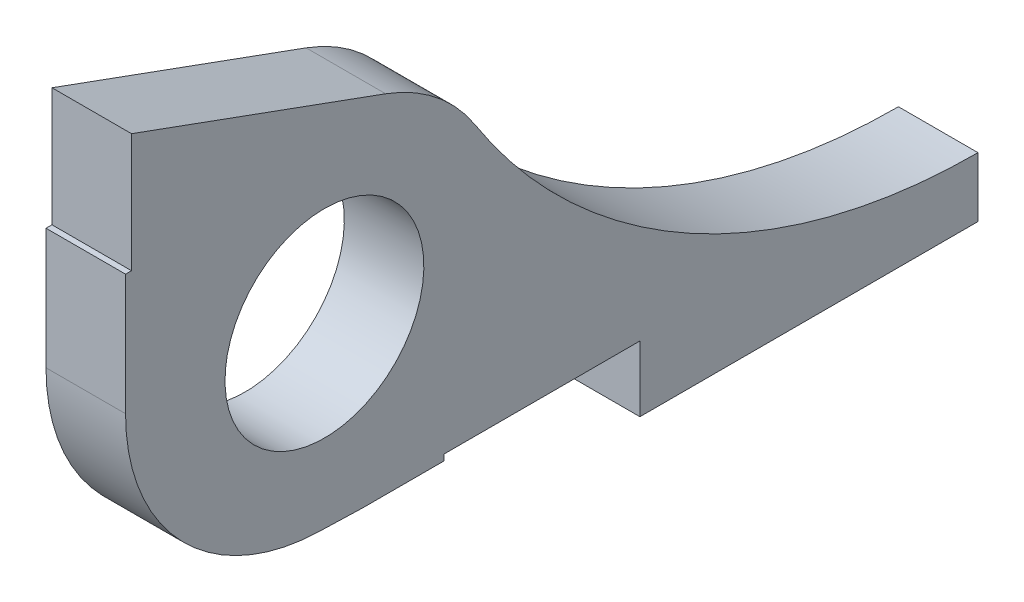
ISO-10303-21;
HEADER;
FILE_DESCRIPTION(('STEP AP214'),'2;1');
FILE_NAME('part.step','',(''),(''),'','','');
FILE_SCHEMA(('AUTOMOTIVE_DESIGN { 1 0 10303 214 1 1 1 1 }'));
ENDSEC;
DATA;
#1=APPLICATION_CONTEXT('core data for automotive mechanical design processes');
#2=APPLICATION_PROTOCOL_DEFINITION('international standard','automotive_design',2000,#1);
#3=PRODUCT_CONTEXT('',#1,'mechanical');
#4=PRODUCT('Part','Part','',(#3));
#5=PRODUCT_RELATED_PRODUCT_CATEGORY('part','',(#4));
#6=PRODUCT_DEFINITION_FORMATION('','',#4);
#7=PRODUCT_DEFINITION_CONTEXT('part definition',#1,'design');
#8=PRODUCT_DEFINITION('design','',#6,#7);
#9=PRODUCT_DEFINITION_SHAPE('','',#8);
#10=(LENGTH_UNIT() NAMED_UNIT(*) SI_UNIT(.MILLI.,.METRE.));
#11=(NAMED_UNIT(*) PLANE_ANGLE_UNIT() SI_UNIT($,.RADIAN.));
#12=(NAMED_UNIT(*) SI_UNIT($,.STERADIAN.) SOLID_ANGLE_UNIT());
#13=UNCERTAINTY_MEASURE_WITH_UNIT(LENGTH_MEASURE(1.E-05),#10,'distance_accuracy_value','');
#14=(GEOMETRIC_REPRESENTATION_CONTEXT(3) GLOBAL_UNCERTAINTY_ASSIGNED_CONTEXT((#13)) GLOBAL_UNIT_ASSIGNED_CONTEXT((#10,
#11,#12)) REPRESENTATION_CONTEXT('',''));
#15=CARTESIAN_POINT('',(0.,0.,0.));
#16=DIRECTION('',(0.,0.,1.));
#17=DIRECTION('',(1.,0.,0.));
#18=AXIS2_PLACEMENT_3D('',#15,#16,#17);
#19=CARTESIAN_POINT('',(195.3,4.3,2.13664654965263));
#20=DIRECTION('',(0.,0.,1.));
#21=DIRECTION('',(1.,0.,0.));
#22=AXIS2_PLACEMENT_3D('',#19,#20,#21);
#23=PLANE('',#22);
#24=DIRECTION('',(0.,-1.,0.));
#25=VECTOR('',#24,1.);
#26=CARTESIAN_POINT('',(191.3,4.3,2.13664654965263));
#27=LINE('',#26,#25);
#28=CARTESIAN_POINT('',(191.3,4.3,2.13664654965263));
#29=VERTEX_POINT('',#28);
#30=CARTESIAN_POINT('',(191.3,1.,2.13664654965263));
#31=VERTEX_POINT('',#30);
#32=EDGE_CURVE('E193',#29,#31,#27,.T.);
#33=ORIENTED_EDGE('',*,*,#32,.T.);
#34=DIRECTION('',(-1.,0.,0.));
#35=VECTOR('',#34,1.);
#36=CARTESIAN_POINT('',(195.3,1.,2.13664654965263));
#37=LINE('',#36,#35);
#38=CARTESIAN_POINT('',(195.3,1.,2.13664654965263));
#39=VERTEX_POINT('',#38);
#40=EDGE_CURVE('E159',#39,#31,#37,.T.);
#41=ORIENTED_EDGE('',*,*,#40,.F.);
#42=DIRECTION('',(0.,-1.,0.));
#43=VECTOR('',#42,1.);
#44=CARTESIAN_POINT('',(195.3,4.3,2.13664654965263));
#45=LINE('',#44,#43);
#46=CARTESIAN_POINT('',(195.3,4.3,2.13664654965263));
#47=VERTEX_POINT('',#46);
#48=EDGE_CURVE('E249',#47,#39,#45,.T.);
#49=ORIENTED_EDGE('',*,*,#48,.F.);
#50=DIRECTION('',(-1.,0.,0.));
#51=VECTOR('',#50,1.);
#52=CARTESIAN_POINT('',(195.3,4.3,2.13664654965263));
#53=LINE('',#52,#51);
#54=EDGE_CURVE('E197',#47,#29,#53,.T.);
#55=ORIENTED_EDGE('',*,*,#54,.T.);
#56=EDGE_LOOP('',(#33,#41,#49,#55));
#57=FACE_BOUND('',#56,.T.);
#58=ADVANCED_FACE('F40',(#57),#23,.T.);
#59=CARTESIAN_POINT('',(195.3,4.3,-14.8633534503474));
#60=DIRECTION('',(0.,0.,-1.));
#61=DIRECTION('',(-1.,0.,0.));
#62=AXIS2_PLACEMENT_3D('',#59,#60,#61);
#63=PLANE('',#62);
#64=DIRECTION('',(0.,-1.,0.));
#65=VECTOR('',#64,1.);
#66=CARTESIAN_POINT('',(195.3,4.3,-14.8633534503474));
#67=LINE('',#66,#65);
#68=CARTESIAN_POINT('',(195.3,4.00000000000068,-14.8633534503474));
#69=VERTEX_POINT('',#68);
#70=CARTESIAN_POINT('',(195.3,1.,-14.8633534503474));
#71=VERTEX_POINT('',#70);
#72=EDGE_CURVE('E176',#69,#71,#67,.T.);
#73=ORIENTED_EDGE('',*,*,#72,.T.);
#74=DIRECTION('',(1.,0.,0.));
#75=VECTOR('',#74,1.);
#76=CARTESIAN_POINT('',(191.3,1.,-14.8633534503474));
#77=LINE('',#76,#75);
#78=CARTESIAN_POINT('',(191.3,1.,-14.8633534503474));
#79=VERTEX_POINT('',#78);
#80=EDGE_CURVE('E57',#79,#71,#77,.T.);
#81=ORIENTED_EDGE('',*,*,#80,.F.);
#82=DIRECTION('',(0.,-1.,0.));
#83=VECTOR('',#82,1.);
#84=CARTESIAN_POINT('',(191.3,4.3,-14.8633534503474));
#85=LINE('',#84,#83);
#86=CARTESIAN_POINT('',(191.3,4.,-14.8633534503474));
#87=VERTEX_POINT('',#86);
#88=EDGE_CURVE('E173',#87,#79,#85,.T.);
#89=ORIENTED_EDGE('',*,*,#88,.F.);
#90=DIRECTION('',(1.,0.,0.));
#91=VECTOR('',#90,1.);
#92=CARTESIAN_POINT('',(191.3,4.00000000000066,-14.8633534503474));
#93=LINE('',#92,#91);
#94=EDGE_CURVE('E196',#87,#69,#93,.T.);
#95=ORIENTED_EDGE('',*,*,#94,.T.);
#96=EDGE_LOOP('',(#73,#81,#89,#95));
#97=FACE_BOUND('',#96,.T.);
#98=ADVANCED_FACE('F172',(#97),#63,.T.);
#99=CARTESIAN_POINT('',(191.3,14.064177772536,18.));
#100=DIRECTION('',(-1.,0.,0.));
#101=DIRECTION('',(0.,-1.,0.));
#102=AXIS2_PLACEMENT_3D('',#99,#100,#101);
#103=PLANE('',#102);
#104=CARTESIAN_POINT('',(191.3,13.0000000000602,18.));
#105=DIRECTION('',(1.,0.,0.));
#106=DIRECTION('',(0.,1.,0.));
#107=AXIS2_PLACEMENT_3D('',#104,#105,#106);
#108=CIRCLE('',#107,5.);
#109=CARTESIAN_POINT('',(191.3,18.0000000000602,18.));
#110=VERTEX_POINT('',#109);
#111=EDGE_CURVE('E184',#110,#110,#108,.T.);
#112=ORIENTED_EDGE('',*,*,#111,.T.);
#113=EDGE_LOOP('',(#112));
#114=FACE_BOUND('',#113,.T.);
#115=ORIENTED_EDGE('',*,*,#88,.T.);
#116=DIRECTION('',(0.,0.,-1.));
#117=VECTOR('',#116,1.);
#118=CARTESIAN_POINT('',(191.3,1.,2.13664654965263));
#119=LINE('',#118,#117);
#120=EDGE_CURVE('E164',#31,#79,#119,.T.);
#121=ORIENTED_EDGE('',*,*,#120,.F.);
#122=ORIENTED_EDGE('',*,*,#32,.F.);
#123=DIRECTION('',(0.,0.,1.));
#124=VECTOR('',#123,1.);
#125=CARTESIAN_POINT('',(191.3,4.3,18.));
#126=LINE('',#125,#124);
#127=CARTESIAN_POINT('',(191.3,4.3,12.));
#128=VERTEX_POINT('',#127);
#129=EDGE_CURVE('E183',#29,#128,#126,.T.);
#130=ORIENTED_EDGE('',*,*,#129,.T.);
#131=DIRECTION('',(0.,-1.,0.));
#132=VECTOR('',#131,1.);
#133=CARTESIAN_POINT('',(191.3,14.064177772536,12.));
#134=LINE('',#133,#132);
#135=CARTESIAN_POINT('',(191.3,4.,12.));
#136=VERTEX_POINT('',#135);
#137=EDGE_CURVE('E186',#128,#136,#134,.T.);
#138=ORIENTED_EDGE('',*,*,#137,.T.);
#139=DIRECTION('',(0.,0.,-1.));
#140=VECTOR('',#139,1.);
#141=CARTESIAN_POINT('',(191.3,4.00000000000066,-14.8633534503474));
#142=LINE('',#141,#140);
#143=CARTESIAN_POINT('',(191.3,4.00000000000066,16.1042417199132));
#144=VERTEX_POINT('',#143);
#145=EDGE_CURVE('E230',#144,#136,#142,.T.);
#146=ORIENTED_EDGE('',*,*,#145,.F.);
#147=DIRECTION('',(0.,-0.0312590373146312,-0.999511316887489));
#148=VECTOR('',#147,1.);
#149=CARTESIAN_POINT('',(191.3,4.00000000000066,16.1042417199132));
#150=LINE('',#149,#148);
#151=CARTESIAN_POINT('',(191.3,4.06906460366128,18.3125903731464));
#152=VERTEX_POINT('',#151);
#153=EDGE_CURVE('E226',#152,#144,#150,.T.);
#154=ORIENTED_EDGE('',*,*,#153,.F.);
#155=CARTESIAN_POINT('',(191.3,14.064177772536,18.));
#156=DIRECTION('',(1.,0.,0.));
#157=DIRECTION('',(0.,-1.,0.));
#158=AXIS2_PLACEMENT_3D('',#155,#156,#157);
#159=CIRCLE('',#158,9.99999999999993);
#160=CARTESIAN_POINT('',(191.3,14.064177772536,28.));
#161=VERTEX_POINT('',#160);
#162=EDGE_CURVE('E227',#161,#152,#159,.T.);
#163=ORIENTED_EDGE('',*,*,#162,.F.);
#164=DIRECTION('',(0.,-1.,0.));
#165=VECTOR('',#164,1.);
#166=CARTESIAN_POINT('',(191.3,14.064177772536,28.));
#167=LINE('',#166,#165);
#168=CARTESIAN_POINT('',(191.3,20.1407400337701,27.9999999999998));
#169=VERTEX_POINT('',#168);
#170=EDGE_CURVE('E240',#169,#161,#167,.T.);
#171=ORIENTED_EDGE('',*,*,#170,.F.);
#172=DIRECTION('',(0.,0.,1.));
#173=VECTOR('',#172,1.);
#174=CARTESIAN_POINT('',(191.3,20.1407400337701,27.6999999999998));
#175=LINE('',#174,#173);
#176=CARTESIAN_POINT('',(191.3,20.1407400337701,27.6999999999998));
#177=VERTEX_POINT('',#176);
#178=EDGE_CURVE('E49',#177,#169,#175,.T.);
#179=ORIENTED_EDGE('',*,*,#178,.F.);
#180=DIRECTION('',(0.,-1.,0.));
#181=VECTOR('',#180,1.);
#182=CARTESIAN_POINT('',(191.3,26.2173022950043,27.6999999999998));
#183=LINE('',#182,#181);
#184=CARTESIAN_POINT('',(191.3,26.1081112247226,27.6999999999998));
#185=VERTEX_POINT('',#184);
#186=EDGE_CURVE('E81',#185,#177,#183,.T.);
#187=ORIENTED_EDGE('',*,*,#186,.F.);
#188=DIRECTION('',(0.,0.342020143325527,0.93969262078596));
#189=VECTOR('',#188,1.);
#190=CARTESIAN_POINT('',(191.3,26.2173022950025,28.));
#191=LINE('',#190,#189);
#192=CARTESIAN_POINT('',(191.3,21.4572335871333,14.9218187100704));
#193=VERTEX_POINT('',#192);
#194=EDGE_CURVE('E209',#193,#185,#191,.T.);
#195=ORIENTED_EDGE('',*,*,#194,.F.);
#196=CARTESIAN_POINT('',(191.3,13.0000000000602,18.));
#197=DIRECTION('',(1.,0.,0.));
#198=DIRECTION('',(0.,-1.,0.));
#199=AXIS2_PLACEMENT_3D('',#196,#197,#198);
#200=CIRCLE('',#199,8.99999999999942);
#201=CARTESIAN_POINT('',(191.3,17.8461538462001,10.4161492037663));
#202=VERTEX_POINT('',#201);
#203=EDGE_CURVE('E235',#202,#193,#200,.T.);
#204=ORIENTED_EDGE('',*,*,#203,.F.);
#205=CARTESIAN_POINT('',(191.3,34.0000000000007,-14.8633534503474));
#206=DIRECTION('',(-1.,0.,0.));
#207=DIRECTION('',(0.,-1.,0.));
#208=AXIS2_PLACEMENT_3D('',#205,#206,#207);
#209=CIRCLE('',#208,30.);
#210=EDGE_CURVE('E182',#87,#202,#209,.T.);
#211=ORIENTED_EDGE('',*,*,#210,.F.);
#212=EDGE_LOOP('',(#115,#121,#122,#130,#138,#146,#154,#163,#171,#179,#187,#195,#204,#211));
#213=FACE_BOUND('',#212,.T.);
#214=ADVANCED_FACE('F180',(#114,#213),#103,.T.);
#215=CARTESIAN_POINT('',(195.3,14.064177772536,18.));
#216=DIRECTION('',(-1.,0.,0.));
#217=DIRECTION('',(0.,-1.,0.));
#218=AXIS2_PLACEMENT_3D('',#215,#216,#217);
#219=PLANE('',#218);
#220=CARTESIAN_POINT('',(195.3,13.0000000000602,18.));
#221=DIRECTION('',(1.,0.,0.));
#222=DIRECTION('',(0.,1.,0.));
#223=AXIS2_PLACEMENT_3D('',#220,#221,#222);
#224=CIRCLE('',#223,5.);
#225=CARTESIAN_POINT('',(195.3,18.0000000000602,18.));
#226=VERTEX_POINT('',#225);
#227=EDGE_CURVE('E189',#226,#226,#224,.T.);
#228=ORIENTED_EDGE('',*,*,#227,.F.);
#229=EDGE_LOOP('',(#228));
#230=FACE_BOUND('',#229,.T.);
#231=DIRECTION('',(0.,0.,1.));
#232=VECTOR('',#231,1.);
#233=CARTESIAN_POINT('',(195.3,1.,-14.8633534503474));
#234=LINE('',#233,#232);
#235=EDGE_CURVE('E177',#71,#39,#234,.T.);
#236=ORIENTED_EDGE('',*,*,#235,.F.);
#237=ORIENTED_EDGE('',*,*,#72,.F.);
#238=CARTESIAN_POINT('',(195.3,34.0000000000007,-14.8633534503474));
#239=DIRECTION('',(-1.,0.,0.));
#240=DIRECTION('',(0.,-1.,0.));
#241=AXIS2_PLACEMENT_3D('',#238,#239,#240);
#242=CIRCLE('',#241,30.);
#243=CARTESIAN_POINT('',(195.3,17.8461538462001,10.4161492037663));
#244=VERTEX_POINT('',#243);
#245=EDGE_CURVE('E247',#69,#244,#242,.T.);
#246=ORIENTED_EDGE('',*,*,#245,.T.);
#247=CARTESIAN_POINT('',(195.3,13.0000000000602,18.));
#248=DIRECTION('',(1.,0.,0.));
#249=DIRECTION('',(0.,-1.,0.));
#250=AXIS2_PLACEMENT_3D('',#247,#248,#249);
#251=CIRCLE('',#250,8.99999999999942);
#252=CARTESIAN_POINT('',(195.3,21.4572335871333,14.9218187100704));
#253=VERTEX_POINT('',#252);
#254=EDGE_CURVE('E244',#244,#253,#251,.T.);
#255=ORIENTED_EDGE('',*,*,#254,.T.);
#256=DIRECTION('',(0.,0.342020143325527,0.93969262078596));
#257=VECTOR('',#256,1.);
#258=CARTESIAN_POINT('',(195.3,26.2173022950025,28.));
#259=LINE('',#258,#257);
#260=CARTESIAN_POINT('',(195.3,26.1081112247226,27.6999999999998));
#261=VERTEX_POINT('',#260);
#262=EDGE_CURVE('E241',#253,#261,#259,.T.);
#263=ORIENTED_EDGE('',*,*,#262,.T.);
#264=DIRECTION('',(0.,1.,0.));
#265=VECTOR('',#264,1.);
#266=CARTESIAN_POINT('',(195.3,14.064177772536,27.6999999999998));
#267=LINE('',#266,#265);
#268=CARTESIAN_POINT('',(195.3,20.1407400337701,27.6999999999998));
#269=VERTEX_POINT('',#268);
#270=EDGE_CURVE('E210',#269,#261,#267,.T.);
#271=ORIENTED_EDGE('',*,*,#270,.F.);
#272=DIRECTION('',(0.,0.,1.));
#273=VECTOR('',#272,1.);
#274=CARTESIAN_POINT('',(195.3,20.1407400337701,18.));
#275=LINE('',#274,#273);
#276=CARTESIAN_POINT('',(195.3,20.1407400337701,27.9999999999998));
#277=VERTEX_POINT('',#276);
#278=EDGE_CURVE('E65',#269,#277,#275,.T.);
#279=ORIENTED_EDGE('',*,*,#278,.T.);
#280=DIRECTION('',(0.,-1.,0.));
#281=VECTOR('',#280,1.);
#282=CARTESIAN_POINT('',(195.3,14.064177772536,28.));
#283=LINE('',#282,#281);
#284=CARTESIAN_POINT('',(195.3,14.064177772536,28.));
#285=VERTEX_POINT('',#284);
#286=EDGE_CURVE('E205',#277,#285,#283,.T.);
#287=ORIENTED_EDGE('',*,*,#286,.T.);
#288=CARTESIAN_POINT('',(195.3,14.064177772536,18.));
#289=DIRECTION('',(1.,0.,0.));
#290=DIRECTION('',(0.,-1.,0.));
#291=AXIS2_PLACEMENT_3D('',#288,#289,#290);
#292=CIRCLE('',#291,9.99999999999993);
#293=CARTESIAN_POINT('',(195.3,4.06906460366129,18.3125903731464));
#294=VERTEX_POINT('',#293);
#295=EDGE_CURVE('E216',#285,#294,#292,.T.);
#296=ORIENTED_EDGE('',*,*,#295,.T.);
#297=DIRECTION('',(0.,-0.0312590373146312,-0.999511316887489));
#298=VECTOR('',#297,1.);
#299=CARTESIAN_POINT('',(195.3,4.00000000000068,16.1042417199132));
#300=LINE('',#299,#298);
#301=CARTESIAN_POINT('',(195.3,4.00000000000068,16.1042417199132));
#302=VERTEX_POINT('',#301);
#303=EDGE_CURVE('E253',#294,#302,#300,.T.);
#304=ORIENTED_EDGE('',*,*,#303,.T.);
#305=DIRECTION('',(0.,0.,-1.));
#306=VECTOR('',#305,1.);
#307=CARTESIAN_POINT('',(195.3,4.00000000000068,-14.8633534503474));
#308=LINE('',#307,#306);
#309=CARTESIAN_POINT('',(195.3,4.,12.));
#310=VERTEX_POINT('',#309);
#311=EDGE_CURVE('E250',#302,#310,#308,.T.);
#312=ORIENTED_EDGE('',*,*,#311,.T.);
#313=DIRECTION('',(0.,-1.,0.));
#314=VECTOR('',#313,1.);
#315=CARTESIAN_POINT('',(195.3,14.064177772536,12.));
#316=LINE('',#315,#314);
#317=CARTESIAN_POINT('',(195.3,4.3,12.));
#318=VERTEX_POINT('',#317);
#319=EDGE_CURVE('E134',#318,#310,#316,.T.);
#320=ORIENTED_EDGE('',*,*,#319,.F.);
#321=DIRECTION('',(0.,0.,1.));
#322=VECTOR('',#321,1.);
#323=CARTESIAN_POINT('',(195.3,4.3,18.));
#324=LINE('',#323,#322);
#325=EDGE_CURVE('E200',#47,#318,#324,.T.);
#326=ORIENTED_EDGE('',*,*,#325,.F.);
#327=ORIENTED_EDGE('',*,*,#48,.T.);
#328=EDGE_LOOP('',(#236,#237,#246,#255,#263,#271,#279,#287,#296,#304,#312,#320,#326,#327));
#329=FACE_BOUND('',#328,.T.);
#330=ADVANCED_FACE('F270',(#230,#329),#219,.F.);
#331=CARTESIAN_POINT('',(191.3,14.064177772536,18.));
#332=DIRECTION('',(1.,0.,0.));
#333=DIRECTION('',(0.,1.,0.));
#334=AXIS2_PLACEMENT_3D('',#331,#332,#333);
#335=CYLINDRICAL_SURFACE('',#334,9.99999999999993);
#336=ORIENTED_EDGE('',*,*,#295,.F.);
#337=DIRECTION('',(1.,0.,0.));
#338=VECTOR('',#337,1.);
#339=CARTESIAN_POINT('',(191.3,14.064177772536,28.));
#340=LINE('',#339,#338);
#341=EDGE_CURVE('E237',#161,#285,#340,.T.);
#342=ORIENTED_EDGE('',*,*,#341,.F.);
#343=ORIENTED_EDGE('',*,*,#162,.T.);
#344=DIRECTION('',(1.,0.,0.));
#345=VECTOR('',#344,1.);
#346=CARTESIAN_POINT('',(191.3,4.06906460366128,18.3125903731464));
#347=LINE('',#346,#345);
#348=EDGE_CURVE('E153',#152,#294,#347,.T.);
#349=ORIENTED_EDGE('',*,*,#348,.T.);
#350=EDGE_LOOP('',(#336,#342,#343,#349));
#351=FACE_BOUND('',#350,.T.);
#352=ADVANCED_FACE('F285',(#351),#335,.T.);
#353=CARTESIAN_POINT('',(191.3,4.00000000000066,16.1042417199132));
#354=DIRECTION('',(0.,-0.999511316887489,0.0312590373146312));
#355=DIRECTION('',(0.,-0.0312590373146312,-0.999511316887489));
#356=AXIS2_PLACEMENT_3D('',#353,#354,#355);
#357=PLANE('',#356);
#358=ORIENTED_EDGE('',*,*,#303,.F.);
#359=ORIENTED_EDGE('',*,*,#348,.F.);
#360=ORIENTED_EDGE('',*,*,#153,.T.);
#361=DIRECTION('',(1.,0.,0.));
#362=VECTOR('',#361,1.);
#363=CARTESIAN_POINT('',(191.3,4.00000000000066,16.1042417199132));
#364=LINE('',#363,#362);
#365=EDGE_CURVE('E228',#144,#302,#364,.T.);
#366=ORIENTED_EDGE('',*,*,#365,.T.);
#367=EDGE_LOOP('',(#358,#359,#360,#366));
#368=FACE_BOUND('',#367,.T.);
#369=ADVANCED_FACE('F282',(#368),#357,.T.);
#370=CARTESIAN_POINT('',(191.3,4.00000000000066,-14.8633534503474));
#371=DIRECTION('',(0.,-1.,0.));
#372=DIRECTION('',(1.,0.,0.));
#373=AXIS2_PLACEMENT_3D('',#370,#371,#372);
#374=PLANE('',#373);
#375=ORIENTED_EDGE('',*,*,#145,.T.);
#376=DIRECTION('',(-1.,0.,0.));
#377=VECTOR('',#376,1.);
#378=CARTESIAN_POINT('',(0.,4.,12.));
#379=LINE('',#378,#377);
#380=EDGE_CURVE('E138',#310,#136,#379,.T.);
#381=ORIENTED_EDGE('',*,*,#380,.F.);
#382=ORIENTED_EDGE('',*,*,#311,.F.);
#383=ORIENTED_EDGE('',*,*,#365,.F.);
#384=EDGE_LOOP('',(#375,#381,#382,#383));
#385=FACE_BOUND('',#384,.T.);
#386=ADVANCED_FACE('F278',(#385),#374,.T.);
#387=CARTESIAN_POINT('',(241.5,4.3,12.));
#388=DIRECTION('',(0.,0.,-1.));
#389=DIRECTION('',(-1.,0.,0.));
#390=AXIS2_PLACEMENT_3D('',#387,#388,#389);
#391=PLANE('',#390);
#392=DIRECTION('',(1.,0.,0.));
#393=VECTOR('',#392,1.);
#394=CARTESIAN_POINT('',(241.5,4.3,12.));
#395=LINE('',#394,#393);
#396=EDGE_CURVE('E44',#128,#318,#395,.T.);
#397=ORIENTED_EDGE('',*,*,#396,.T.);
#398=ORIENTED_EDGE('',*,*,#319,.T.);
#399=ORIENTED_EDGE('',*,*,#380,.T.);
#400=ORIENTED_EDGE('',*,*,#137,.F.);
#401=EDGE_LOOP('',(#397,#398,#399,#400));
#402=FACE_BOUND('',#401,.T.);
#403=ADVANCED_FACE('F275',(#402),#391,.T.);
#404=CARTESIAN_POINT('',(0.,4.3,0.));
#405=DIRECTION('',(0.,-1.,0.));
#406=DIRECTION('',(0.,0.,-1.));
#407=AXIS2_PLACEMENT_3D('',#404,#405,#406);
#408=PLANE('',#407);
#409=ORIENTED_EDGE('',*,*,#54,.F.);
#410=ORIENTED_EDGE('',*,*,#325,.T.);
#411=ORIENTED_EDGE('',*,*,#396,.F.);
#412=ORIENTED_EDGE('',*,*,#129,.F.);
#413=EDGE_LOOP('',(#409,#410,#411,#412));
#414=FACE_BOUND('',#413,.T.);
#415=ADVANCED_FACE('F273',(#414),#408,.T.);
#416=CARTESIAN_POINT('',(191.3,34.0000000000007,-14.8633534503474));
#417=DIRECTION('',(1.,0.,0.));
#418=DIRECTION('',(0.,1.,0.));
#419=AXIS2_PLACEMENT_3D('',#416,#417,#418);
#420=CYLINDRICAL_SURFACE('',#419,30.);
#421=ORIENTED_EDGE('',*,*,#245,.F.);
#422=ORIENTED_EDGE('',*,*,#94,.F.);
#423=ORIENTED_EDGE('',*,*,#210,.T.);
#424=DIRECTION('',(1.,0.,0.));
#425=VECTOR('',#424,1.);
#426=CARTESIAN_POINT('',(191.3,17.8461538462001,10.4161492037663));
#427=LINE('',#426,#425);
#428=EDGE_CURVE('E232',#202,#244,#427,.T.);
#429=ORIENTED_EDGE('',*,*,#428,.T.);
#430=EDGE_LOOP('',(#421,#422,#423,#429));
#431=FACE_BOUND('',#430,.T.);
#432=ADVANCED_FACE('F300',(#431),#420,.F.);
#433=CARTESIAN_POINT('',(191.3,13.0000000000602,18.));
#434=DIRECTION('',(1.,0.,0.));
#435=DIRECTION('',(0.,1.,0.));
#436=AXIS2_PLACEMENT_3D('',#433,#434,#435);
#437=CYLINDRICAL_SURFACE('',#436,8.99999999999942);
#438=ORIENTED_EDGE('',*,*,#254,.F.);
#439=ORIENTED_EDGE('',*,*,#428,.F.);
#440=ORIENTED_EDGE('',*,*,#203,.T.);
#441=DIRECTION('',(1.,0.,0.));
#442=VECTOR('',#441,1.);
#443=CARTESIAN_POINT('',(191.3,21.4572335871333,14.9218187100704));
#444=LINE('',#443,#442);
#445=EDGE_CURVE('E90',#193,#253,#444,.T.);
#446=ORIENTED_EDGE('',*,*,#445,.T.);
#447=EDGE_LOOP('',(#438,#439,#440,#446));
#448=FACE_BOUND('',#447,.T.);
#449=ADVANCED_FACE('F297',(#448),#437,.T.);
#450=CARTESIAN_POINT('',(191.3,13.0000000000602,18.));
#451=DIRECTION('',(1.,0.,0.));
#452=DIRECTION('',(0.,1.,0.));
#453=AXIS2_PLACEMENT_3D('',#450,#451,#452);
#454=CYLINDRICAL_SURFACE('',#453,5.);
#455=ORIENTED_EDGE('',*,*,#111,.F.);
#456=EDGE_LOOP('',(#455));
#457=FACE_BOUND('',#456,.T.);
#458=ORIENTED_EDGE('',*,*,#227,.T.);
#459=EDGE_LOOP('',(#458));
#460=FACE_BOUND('',#459,.T.);
#461=ADVANCED_FACE('F307',(#457,#460),#454,.F.);
#462=CARTESIAN_POINT('',(191.3,14.064177772536,28.));
#463=DIRECTION('',(0.,0.,1.));
#464=DIRECTION('',(1.,0.,0.));
#465=AXIS2_PLACEMENT_3D('',#462,#463,#464);
#466=PLANE('',#465);
#467=ORIENTED_EDGE('',*,*,#286,.F.);
#468=DIRECTION('',(1.,0.,0.));
#469=VECTOR('',#468,1.);
#470=CARTESIAN_POINT('',(240.3,20.1407400337701,27.9999999999998));
#471=LINE('',#470,#469);
#472=EDGE_CURVE('E11',#169,#277,#471,.T.);
#473=ORIENTED_EDGE('',*,*,#472,.F.);
#474=ORIENTED_EDGE('',*,*,#170,.T.);
#475=ORIENTED_EDGE('',*,*,#341,.T.);
#476=EDGE_LOOP('',(#467,#473,#474,#475));
#477=FACE_BOUND('',#476,.T.);
#478=ADVANCED_FACE('F290',(#477),#466,.T.);
#479=CARTESIAN_POINT('',(191.3,26.2173022950025,28.));
#480=DIRECTION('',(0.,0.93969262078596,-0.342020143325527));
#481=DIRECTION('',(0.,0.342020143325527,0.93969262078596));
#482=AXIS2_PLACEMENT_3D('',#479,#480,#481);
#483=PLANE('',#482);
#484=ORIENTED_EDGE('',*,*,#194,.T.);
#485=DIRECTION('',(1.,0.,0.));
#486=VECTOR('',#485,1.);
#487=CARTESIAN_POINT('',(191.3,26.1081112247226,27.6999999999998));
#488=LINE('',#487,#486);
#489=EDGE_CURVE('E206',#185,#261,#488,.T.);
#490=ORIENTED_EDGE('',*,*,#489,.T.);
#491=ORIENTED_EDGE('',*,*,#262,.F.);
#492=ORIENTED_EDGE('',*,*,#445,.F.);
#493=EDGE_LOOP('',(#484,#490,#491,#492));
#494=FACE_BOUND('',#493,.T.);
#495=ADVANCED_FACE('F294',(#494),#483,.T.);
#496=CARTESIAN_POINT('',(0.,0.,27.6999999999998));
#497=DIRECTION('',(0.,0.,1.));
#498=DIRECTION('',(1.,0.,0.));
#499=AXIS2_PLACEMENT_3D('',#496,#497,#498);
#500=PLANE('',#499);
#501=ORIENTED_EDGE('',*,*,#186,.T.);
#502=DIRECTION('',(1.,0.,0.));
#503=VECTOR('',#502,1.);
#504=CARTESIAN_POINT('',(191.3,20.1407400337701,27.6999999999998));
#505=LINE('',#504,#503);
#506=EDGE_CURVE('E212',#177,#269,#505,.T.);
#507=ORIENTED_EDGE('',*,*,#506,.T.);
#508=ORIENTED_EDGE('',*,*,#270,.T.);
#509=ORIENTED_EDGE('',*,*,#489,.F.);
#510=EDGE_LOOP('',(#501,#507,#508,#509));
#511=FACE_BOUND('',#510,.T.);
#512=ADVANCED_FACE('F292',(#511),#500,.T.);
#513=CARTESIAN_POINT('',(191.3,20.1407400337701,27.6999999999998));
#514=DIRECTION('',(0.,-1.,0.));
#515=DIRECTION('',(0.,0.,-1.));
#516=AXIS2_PLACEMENT_3D('',#513,#514,#515);
#517=PLANE('',#516);
#518=ORIENTED_EDGE('',*,*,#506,.F.);
#519=ORIENTED_EDGE('',*,*,#178,.T.);
#520=ORIENTED_EDGE('',*,*,#472,.T.);
#521=ORIENTED_EDGE('',*,*,#278,.F.);
#522=EDGE_LOOP('',(#518,#519,#520,#521));
#523=FACE_BOUND('',#522,.T.);
#524=ADVANCED_FACE('F42',(#523),#517,.F.);
#525=CARTESIAN_POINT('',(0.,1.,0.));
#526=DIRECTION('',(0.,-1.,0.));
#527=DIRECTION('',(0.,0.,-1.));
#528=AXIS2_PLACEMENT_3D('',#525,#526,#527);
#529=PLANE('',#528);
#530=ORIENTED_EDGE('',*,*,#120,.T.);
#531=ORIENTED_EDGE('',*,*,#80,.T.);
#532=ORIENTED_EDGE('',*,*,#235,.T.);
#533=ORIENTED_EDGE('',*,*,#40,.T.);
#534=EDGE_LOOP('',(#530,#531,#532,#533));
#535=FACE_BOUND('',#534,.T.);
#536=ADVANCED_FACE('F165',(#535),#529,.T.);
#537=CLOSED_SHELL('',(#58,#98,#214,#330,#352,#369,#386,#403,#415,#432,#449,#461,#478,#495,#512,
#524,#536));
#538=MANIFOLD_SOLID_BREP('B2',#537);
#539=ADVANCED_BREP_SHAPE_REPRESENTATION('',(#18,#538),#14);
#540=SHAPE_DEFINITION_REPRESENTATION(#9,#539);
ENDSEC;
END-ISO-10303-21;
